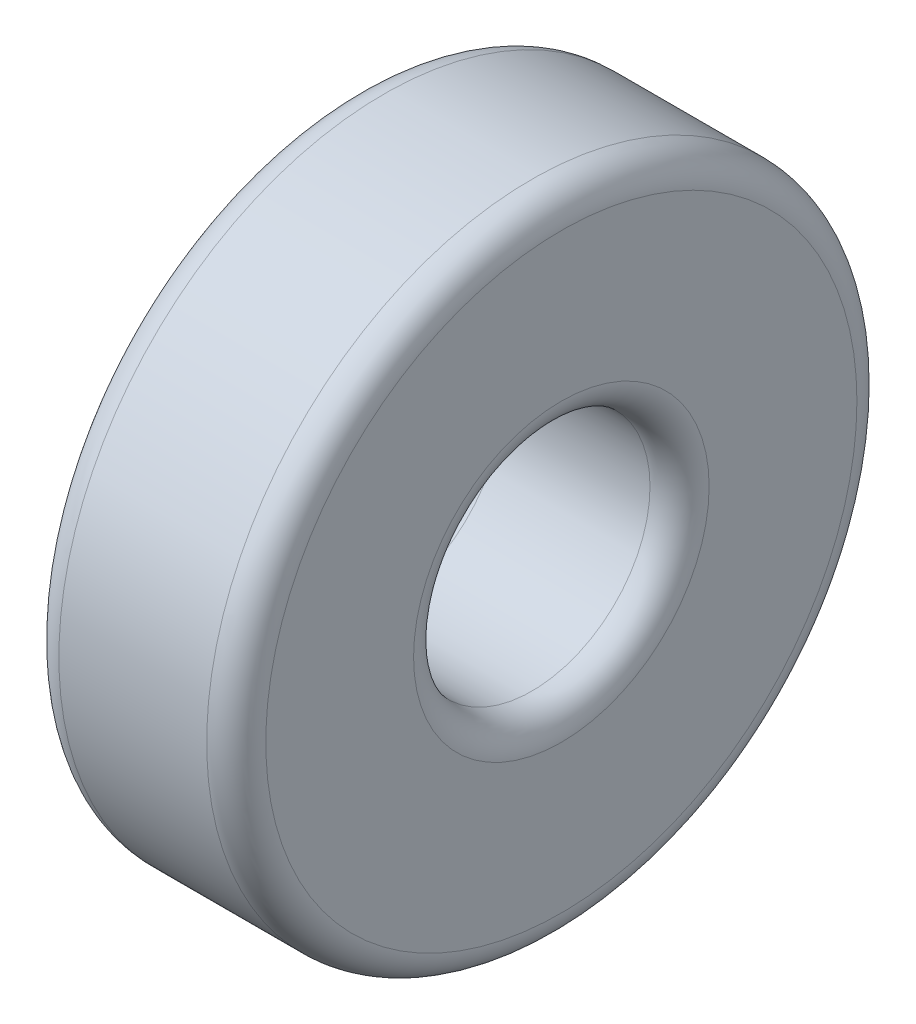
ISO-10303-21;
HEADER;
FILE_DESCRIPTION(('STEP AP214'),'2;1');
FILE_NAME('part.step','',(''),(''),'','','');
FILE_SCHEMA(('AUTOMOTIVE_DESIGN { 1 0 10303 214 1 1 1 1 }'));
ENDSEC;
DATA;
#1=APPLICATION_CONTEXT('core data for automotive mechanical design processes');
#2=APPLICATION_PROTOCOL_DEFINITION('international standard','automotive_design',2000,#1);
#3=PRODUCT_CONTEXT('',#1,'mechanical');
#4=PRODUCT('Part','Part','',(#3));
#5=PRODUCT_RELATED_PRODUCT_CATEGORY('part','',(#4));
#6=PRODUCT_DEFINITION_FORMATION('','',#4);
#7=PRODUCT_DEFINITION_CONTEXT('part definition',#1,'design');
#8=PRODUCT_DEFINITION('design','',#6,#7);
#9=PRODUCT_DEFINITION_SHAPE('','',#8);
#10=(LENGTH_UNIT() NAMED_UNIT(*) SI_UNIT(.MILLI.,.METRE.));
#11=(NAMED_UNIT(*) PLANE_ANGLE_UNIT() SI_UNIT($,.RADIAN.));
#12=(NAMED_UNIT(*) SI_UNIT($,.STERADIAN.) SOLID_ANGLE_UNIT());
#13=UNCERTAINTY_MEASURE_WITH_UNIT(LENGTH_MEASURE(1.E-05),#10,'distance_accuracy_value','');
#14=(GEOMETRIC_REPRESENTATION_CONTEXT(3) GLOBAL_UNCERTAINTY_ASSIGNED_CONTEXT((#13)) GLOBAL_UNIT_ASSIGNED_CONTEXT((#10,
#11,#12)) REPRESENTATION_CONTEXT('',''));
#15=CARTESIAN_POINT('',(0.,0.,0.));
#16=DIRECTION('',(0.,0.,1.));
#17=DIRECTION('',(1.,0.,0.));
#18=AXIS2_PLACEMENT_3D('',#15,#16,#17);
#19=CARTESIAN_POINT('',(7.,0.,0.));
#20=DIRECTION('',(1.,0.,0.));
#21=DIRECTION('',(0.,0.,-1.));
#22=AXIS2_PLACEMENT_3D('',#19,#20,#21);
#23=PLANE('',#22);
#24=CARTESIAN_POINT('',(7.,0.,0.));
#25=DIRECTION('',(1.,0.,0.));
#26=DIRECTION('',(0.,0.,-1.));
#27=AXIS2_PLACEMENT_3D('',#24,#25,#26);
#28=CIRCLE('',#27,5.);
#29=CARTESIAN_POINT('',(7.,0.,-5.));
#30=VERTEX_POINT('',#29);
#31=EDGE_CURVE('E50',#30,#30,#28,.F.);
#32=ORIENTED_EDGE('',*,*,#31,.T.);
#33=EDGE_LOOP('',(#32));
#34=FACE_BOUND('',#33,.T.);
#35=CARTESIAN_POINT('',(7.,0.,0.));
#36=DIRECTION('',(1.,0.,0.));
#37=DIRECTION('',(0.,0.,-1.));
#38=AXIS2_PLACEMENT_3D('',#35,#36,#37);
#39=CIRCLE('',#38,10.);
#40=CARTESIAN_POINT('',(7.,0.,-10.));
#41=VERTEX_POINT('',#40);
#42=EDGE_CURVE('E55',#41,#41,#39,.T.);
#43=ORIENTED_EDGE('',*,*,#42,.T.);
#44=EDGE_LOOP('',(#43));
#45=FACE_BOUND('',#44,.T.);
#46=ADVANCED_FACE('F37',(#34,#45),#23,.T.);
#47=CARTESIAN_POINT('',(0.,0.,0.));
#48=DIRECTION('',(1.,0.,0.));
#49=DIRECTION('',(0.,0.,-1.));
#50=AXIS2_PLACEMENT_3D('',#47,#48,#49);
#51=PLANE('',#50);
#52=CARTESIAN_POINT('',(0.,0.,0.));
#53=DIRECTION('',(1.,0.,0.));
#54=DIRECTION('',(0.,0.,-1.));
#55=AXIS2_PLACEMENT_3D('',#52,#53,#54);
#56=CIRCLE('',#55,5.);
#57=CARTESIAN_POINT('',(0.,0.,-5.));
#58=VERTEX_POINT('',#57);
#59=EDGE_CURVE('E69',#58,#58,#56,.T.);
#60=ORIENTED_EDGE('',*,*,#59,.T.);
#61=EDGE_LOOP('',(#60));
#62=FACE_BOUND('',#61,.T.);
#63=CARTESIAN_POINT('',(0.,0.,0.));
#64=DIRECTION('',(1.,0.,0.));
#65=DIRECTION('',(0.,0.,-1.));
#66=AXIS2_PLACEMENT_3D('',#63,#64,#65);
#67=CIRCLE('',#66,10.);
#68=CARTESIAN_POINT('',(0.,0.,-10.));
#69=VERTEX_POINT('',#68);
#70=EDGE_CURVE('E73',#69,#69,#67,.F.);
#71=ORIENTED_EDGE('',*,*,#70,.T.);
#72=EDGE_LOOP('',(#71));
#73=FACE_BOUND('',#72,.T.);
#74=ADVANCED_FACE('F78',(#62,#73),#51,.F.);
#75=CARTESIAN_POINT('',(7.,0.,0.));
#76=DIRECTION('',(-1.,0.,0.));
#77=DIRECTION('',(0.,0.,1.));
#78=AXIS2_PLACEMENT_3D('',#75,#76,#77);
#79=CYLINDRICAL_SURFACE('',#78,11.);
#80=CARTESIAN_POINT('',(1.,0.,0.));
#81=DIRECTION('',(1.,0.,0.));
#82=DIRECTION('',(0.,0.,-1.));
#83=AXIS2_PLACEMENT_3D('',#80,#81,#82);
#84=CIRCLE('',#83,11.);
#85=CARTESIAN_POINT('',(1.,0.,-11.));
#86=VERTEX_POINT('',#85);
#87=EDGE_CURVE('E10',#86,#86,#84,.T.);
#88=ORIENTED_EDGE('',*,*,#87,.T.);
#89=EDGE_LOOP('',(#88));
#90=FACE_BOUND('',#89,.T.);
#91=CARTESIAN_POINT('',(6.,0.,0.));
#92=DIRECTION('',(1.,0.,0.));
#93=DIRECTION('',(0.,0.,-1.));
#94=AXIS2_PLACEMENT_3D('',#91,#92,#93);
#95=CIRCLE('',#94,11.);
#96=CARTESIAN_POINT('',(6.,0.,-11.));
#97=VERTEX_POINT('',#96);
#98=EDGE_CURVE('E45',#97,#97,#95,.F.);
#99=ORIENTED_EDGE('',*,*,#98,.T.);
#100=EDGE_LOOP('',(#99));
#101=FACE_BOUND('',#100,.T.);
#102=ADVANCED_FACE('F98',(#90,#101),#79,.T.);
#103=CARTESIAN_POINT('',(7.,0.,0.));
#104=DIRECTION('',(-1.,0.,0.));
#105=DIRECTION('',(0.,0.,1.));
#106=AXIS2_PLACEMENT_3D('',#103,#104,#105);
#107=CYLINDRICAL_SURFACE('',#106,4.);
#108=CARTESIAN_POINT('',(1.,0.,0.));
#109=DIRECTION('',(1.,0.,0.));
#110=DIRECTION('',(0.,0.,-1.));
#111=AXIS2_PLACEMENT_3D('',#108,#109,#110);
#112=CIRCLE('',#111,4.);
#113=CARTESIAN_POINT('',(1.,0.,-4.));
#114=VERTEX_POINT('',#113);
#115=EDGE_CURVE('E61',#114,#114,#112,.F.);
#116=ORIENTED_EDGE('',*,*,#115,.T.);
#117=EDGE_LOOP('',(#116));
#118=FACE_BOUND('',#117,.T.);
#119=CARTESIAN_POINT('',(6.,0.,0.));
#120=DIRECTION('',(1.,0.,0.));
#121=DIRECTION('',(0.,0.,-1.));
#122=AXIS2_PLACEMENT_3D('',#119,#120,#121);
#123=CIRCLE('',#122,4.);
#124=CARTESIAN_POINT('',(6.,0.,-4.));
#125=VERTEX_POINT('',#124);
#126=EDGE_CURVE('E65',#125,#125,#123,.T.);
#127=ORIENTED_EDGE('',*,*,#126,.T.);
#128=EDGE_LOOP('',(#127));
#129=FACE_BOUND('',#128,.T.);
#130=ADVANCED_FACE('F103',(#118,#129),#107,.F.);
#131=CARTESIAN_POINT('',(1.,0.,0.));
#132=DIRECTION('',(1.,0.,0.));
#133=DIRECTION('',(0.,0.,-1.));
#134=AXIS2_PLACEMENT_3D('',#131,#132,#133);
#135=TOROIDAL_SURFACE('',#134,5.,1.);
#136=ORIENTED_EDGE('',*,*,#115,.F.);
#137=EDGE_LOOP('',(#136));
#138=FACE_BOUND('',#137,.T.);
#139=ORIENTED_EDGE('',*,*,#59,.F.);
#140=EDGE_LOOP('',(#139));
#141=FACE_BOUND('',#140,.T.);
#142=ADVANCED_FACE('F89',(#138,#141),#135,.T.);
#143=CARTESIAN_POINT('',(6.,0.,0.));
#144=DIRECTION('',(1.,0.,0.));
#145=DIRECTION('',(0.,0.,-1.));
#146=AXIS2_PLACEMENT_3D('',#143,#144,#145);
#147=TOROIDAL_SURFACE('',#146,5.,1.);
#148=ORIENTED_EDGE('',*,*,#31,.F.);
#149=EDGE_LOOP('',(#148));
#150=FACE_BOUND('',#149,.T.);
#151=ORIENTED_EDGE('',*,*,#126,.F.);
#152=EDGE_LOOP('',(#151));
#153=FACE_BOUND('',#152,.T.);
#154=ADVANCED_FACE('F83',(#150,#153),#147,.T.);
#155=CARTESIAN_POINT('',(1.,0.,0.));
#156=DIRECTION('',(1.,0.,0.));
#157=DIRECTION('',(0.,0.,-1.));
#158=AXIS2_PLACEMENT_3D('',#155,#156,#157);
#159=TOROIDAL_SURFACE('',#158,10.,1.);
#160=ORIENTED_EDGE('',*,*,#70,.F.);
#161=EDGE_LOOP('',(#160));
#162=FACE_BOUND('',#161,.T.);
#163=ORIENTED_EDGE('',*,*,#87,.F.);
#164=EDGE_LOOP('',(#163));
#165=FACE_BOUND('',#164,.T.);
#166=ADVANCED_FACE('F80',(#162,#165),#159,.T.);
#167=CARTESIAN_POINT('',(6.,0.,0.));
#168=DIRECTION('',(1.,0.,0.));
#169=DIRECTION('',(0.,0.,-1.));
#170=AXIS2_PLACEMENT_3D('',#167,#168,#169);
#171=TOROIDAL_SURFACE('',#170,10.,1.);
#172=ORIENTED_EDGE('',*,*,#98,.F.);
#173=EDGE_LOOP('',(#172));
#174=FACE_BOUND('',#173,.T.);
#175=ORIENTED_EDGE('',*,*,#42,.F.);
#176=EDGE_LOOP('',(#175));
#177=FACE_BOUND('',#176,.T.);
#178=ADVANCED_FACE('F39',(#174,#177),#171,.T.);
#179=CLOSED_SHELL('',(#46,#74,#102,#130,#142,#154,#166,#178));
#180=MANIFOLD_SOLID_BREP('B2',#179);
#181=ADVANCED_BREP_SHAPE_REPRESENTATION('',(#18,#180),#14);
#182=SHAPE_DEFINITION_REPRESENTATION(#9,#181);
ENDSEC;
END-ISO-10303-21;
